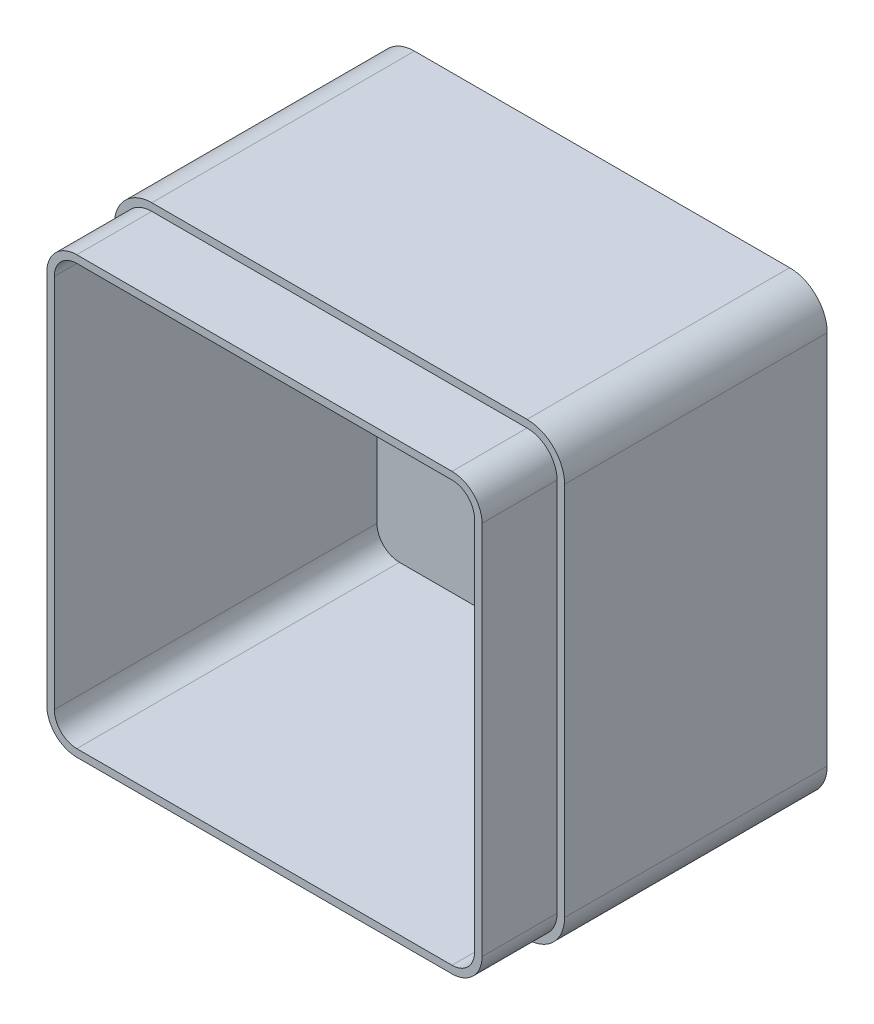
ISO-10303-21;
HEADER;
FILE_DESCRIPTION(('STEP AP214'),'2;1');
FILE_NAME('part.step','',(''),(''),'','','');
FILE_SCHEMA(('AUTOMOTIVE_DESIGN { 1 0 10303 214 1 1 1 1 }'));
ENDSEC;
DATA;
#1=APPLICATION_CONTEXT('core data for automotive mechanical design processes');
#2=APPLICATION_PROTOCOL_DEFINITION('international standard','automotive_design',2000,#1);
#3=PRODUCT_CONTEXT('',#1,'mechanical');
#4=PRODUCT('Part','Part','',(#3));
#5=PRODUCT_RELATED_PRODUCT_CATEGORY('part','',(#4));
#6=PRODUCT_DEFINITION_FORMATION('','',#4);
#7=PRODUCT_DEFINITION_CONTEXT('part definition',#1,'design');
#8=PRODUCT_DEFINITION('design','',#6,#7);
#9=PRODUCT_DEFINITION_SHAPE('','',#8);
#10=(LENGTH_UNIT() NAMED_UNIT(*) SI_UNIT(.MILLI.,.METRE.));
#11=(NAMED_UNIT(*) PLANE_ANGLE_UNIT() SI_UNIT($,.RADIAN.));
#12=(NAMED_UNIT(*) SI_UNIT($,.STERADIAN.) SOLID_ANGLE_UNIT());
#13=UNCERTAINTY_MEASURE_WITH_UNIT(LENGTH_MEASURE(1.E-05),#10,'distance_accuracy_value','');
#14=(GEOMETRIC_REPRESENTATION_CONTEXT(3) GLOBAL_UNCERTAINTY_ASSIGNED_CONTEXT((#13)) GLOBAL_UNIT_ASSIGNED_CONTEXT((#10,
#11,#12)) REPRESENTATION_CONTEXT('',''));
#15=CARTESIAN_POINT('',(0.,0.,0.));
#16=DIRECTION('',(0.,0.,1.));
#17=DIRECTION('',(1.,0.,0.));
#18=AXIS2_PLACEMENT_3D('',#15,#16,#17);
#19=CARTESIAN_POINT('',(0.,0.,90.));
#20=DIRECTION('',(0.,0.,-1.));
#21=DIRECTION('',(-1.,0.,0.));
#22=AXIS2_PLACEMENT_3D('',#19,#20,#21);
#23=PLANE('',#22);
#24=DIRECTION('',(0.,1.,0.));
#25=VECTOR('',#24,1.);
#26=CARTESIAN_POINT('',(116.,0.,90.));
#27=LINE('',#26,#25);
#28=CARTESIAN_POINT('',(116.,10.,90.));
#29=VERTEX_POINT('',#28);
#30=CARTESIAN_POINT('',(116.,110.,90.));
#31=VERTEX_POINT('',#30);
#32=EDGE_CURVE('E335',#29,#31,#27,.T.);
#33=ORIENTED_EDGE('',*,*,#32,.F.);
#34=CARTESIAN_POINT('',(110.,10.,90.));
#35=DIRECTION('',(0.,0.,-1.));
#36=DIRECTION('',(-1.,0.,0.));
#37=AXIS2_PLACEMENT_3D('',#34,#35,#36);
#38=CIRCLE('',#37,6.);
#39=CARTESIAN_POINT('',(110.,4.,90.));
#40=VERTEX_POINT('',#39);
#41=EDGE_CURVE('E333',#40,#29,#38,.F.);
#42=ORIENTED_EDGE('',*,*,#41,.F.);
#43=DIRECTION('',(1.,0.,0.));
#44=VECTOR('',#43,1.);
#45=CARTESIAN_POINT('',(0.,4.,90.));
#46=LINE('',#45,#44);
#47=CARTESIAN_POINT('',(9.99999999999999,4.,90.));
#48=VERTEX_POINT('',#47);
#49=EDGE_CURVE('E330',#48,#40,#46,.T.);
#50=ORIENTED_EDGE('',*,*,#49,.F.);
#51=CARTESIAN_POINT('',(10.,10.,90.));
#52=DIRECTION('',(0.,0.,-1.));
#53=DIRECTION('',(-1.,0.,0.));
#54=AXIS2_PLACEMENT_3D('',#51,#52,#53);
#55=CIRCLE('',#54,6.);
#56=CARTESIAN_POINT('',(4.,9.99999999999999,90.));
#57=VERTEX_POINT('',#56);
#58=EDGE_CURVE('E331',#57,#48,#55,.F.);
#59=ORIENTED_EDGE('',*,*,#58,.F.);
#60=DIRECTION('',(0.,-1.,0.));
#61=VECTOR('',#60,1.);
#62=CARTESIAN_POINT('',(4.,0.,90.));
#63=LINE('',#62,#61);
#64=CARTESIAN_POINT('',(4.,110.,90.));
#65=VERTEX_POINT('',#64);
#66=EDGE_CURVE('E296',#65,#57,#63,.T.);
#67=ORIENTED_EDGE('',*,*,#66,.F.);
#68=CARTESIAN_POINT('',(10.,110.,90.));
#69=DIRECTION('',(0.,0.,-1.));
#70=DIRECTION('',(-1.,0.,0.));
#71=AXIS2_PLACEMENT_3D('',#68,#69,#70);
#72=CIRCLE('',#71,6.);
#73=CARTESIAN_POINT('',(9.99999999999999,116.,90.));
#74=VERTEX_POINT('',#73);
#75=EDGE_CURVE('E322',#74,#65,#72,.F.);
#76=ORIENTED_EDGE('',*,*,#75,.F.);
#77=DIRECTION('',(-1.,0.,0.));
#78=VECTOR('',#77,1.);
#79=CARTESIAN_POINT('',(0.,116.,90.));
#80=LINE('',#79,#78);
#81=CARTESIAN_POINT('',(110.,116.,90.));
#82=VERTEX_POINT('',#81);
#83=EDGE_CURVE('E327',#82,#74,#80,.T.);
#84=ORIENTED_EDGE('',*,*,#83,.F.);
#85=CARTESIAN_POINT('',(110.,110.,90.));
#86=DIRECTION('',(0.,0.,-1.));
#87=DIRECTION('',(-1.,0.,0.));
#88=AXIS2_PLACEMENT_3D('',#85,#86,#87);
#89=CIRCLE('',#88,6.);
#90=EDGE_CURVE('E317',#31,#82,#89,.F.);
#91=ORIENTED_EDGE('',*,*,#90,.F.);
#92=EDGE_LOOP('',(#33,#42,#50,#59,#67,#76,#84,#91));
#93=FACE_BOUND('',#92,.T.);
#94=CARTESIAN_POINT('',(110.,10.,90.));
#95=DIRECTION('',(0.,0.,1.));
#96=DIRECTION('',(1.,0.,0.));
#97=AXIS2_PLACEMENT_3D('',#94,#95,#96);
#98=CIRCLE('',#97,7.99999999999999);
#99=CARTESIAN_POINT('',(110.,2.,90.));
#100=VERTEX_POINT('',#99);
#101=CARTESIAN_POINT('',(118.,10.,90.));
#102=VERTEX_POINT('',#101);
#103=EDGE_CURVE('E240',#100,#102,#98,.T.);
#104=ORIENTED_EDGE('',*,*,#103,.T.);
#105=DIRECTION('',(0.,1.,0.));
#106=VECTOR('',#105,1.);
#107=CARTESIAN_POINT('',(118.,10.,90.));
#108=LINE('',#107,#106);
#109=CARTESIAN_POINT('',(118.,110.,90.));
#110=VERTEX_POINT('',#109);
#111=EDGE_CURVE('E200',#102,#110,#108,.T.);
#112=ORIENTED_EDGE('',*,*,#111,.T.);
#113=CARTESIAN_POINT('',(110.,110.,90.));
#114=DIRECTION('',(0.,0.,1.));
#115=DIRECTION('',(1.,0.,0.));
#116=AXIS2_PLACEMENT_3D('',#113,#114,#115);
#117=CIRCLE('',#116,7.99999999999999);
#118=CARTESIAN_POINT('',(110.,118.,90.));
#119=VERTEX_POINT('',#118);
#120=EDGE_CURVE('E48',#110,#119,#117,.T.);
#121=ORIENTED_EDGE('',*,*,#120,.T.);
#122=DIRECTION('',(-1.,0.,0.));
#123=VECTOR('',#122,1.);
#124=CARTESIAN_POINT('',(110.,118.,90.));
#125=LINE('',#124,#123);
#126=CARTESIAN_POINT('',(9.99999999999999,118.,90.));
#127=VERTEX_POINT('',#126);
#128=EDGE_CURVE('E244',#119,#127,#125,.T.);
#129=ORIENTED_EDGE('',*,*,#128,.T.);
#130=CARTESIAN_POINT('',(10.,110.,90.));
#131=DIRECTION('',(0.,0.,1.));
#132=DIRECTION('',(1.,0.,0.));
#133=AXIS2_PLACEMENT_3D('',#130,#131,#132);
#134=CIRCLE('',#133,7.99999999999999);
#135=CARTESIAN_POINT('',(2.,110.,90.));
#136=VERTEX_POINT('',#135);
#137=EDGE_CURVE('E247',#127,#136,#134,.T.);
#138=ORIENTED_EDGE('',*,*,#137,.T.);
#139=DIRECTION('',(0.,-1.,0.));
#140=VECTOR('',#139,1.);
#141=CARTESIAN_POINT('',(2.,110.,90.));
#142=LINE('',#141,#140);
#143=CARTESIAN_POINT('',(2.,9.99999999999999,90.));
#144=VERTEX_POINT('',#143);
#145=EDGE_CURVE('E250',#136,#144,#142,.T.);
#146=ORIENTED_EDGE('',*,*,#145,.T.);
#147=CARTESIAN_POINT('',(10.,10.,90.));
#148=DIRECTION('',(0.,0.,1.));
#149=DIRECTION('',(1.,0.,0.));
#150=AXIS2_PLACEMENT_3D('',#147,#148,#149);
#151=CIRCLE('',#150,8.);
#152=CARTESIAN_POINT('',(9.99999999999999,2.,90.));
#153=VERTEX_POINT('',#152);
#154=EDGE_CURVE('E223',#144,#153,#151,.T.);
#155=ORIENTED_EDGE('',*,*,#154,.T.);
#156=DIRECTION('',(1.,0.,0.));
#157=VECTOR('',#156,1.);
#158=CARTESIAN_POINT('',(10.,2.,90.));
#159=LINE('',#158,#157);
#160=EDGE_CURVE('E220',#153,#100,#159,.T.);
#161=ORIENTED_EDGE('',*,*,#160,.T.);
#162=EDGE_LOOP('',(#104,#112,#121,#129,#138,#146,#155,#161));
#163=FACE_BOUND('',#162,.T.);
#164=ADVANCED_FACE('F33',(#93,#163),#23,.F.);
#165=CARTESIAN_POINT('',(4.,0.,90.));
#166=DIRECTION('',(1.,0.,0.));
#167=DIRECTION('',(0.,0.,-1.));
#168=AXIS2_PLACEMENT_3D('',#165,#166,#167);
#169=PLANE('',#168);
#170=DIRECTION('',(0.,-1.,0.));
#171=VECTOR('',#170,1.);
#172=CARTESIAN_POINT('',(4.,0.,4.));
#173=LINE('',#172,#171);
#174=CARTESIAN_POINT('',(4.,110.,4.));
#175=VERTEX_POINT('',#174);
#176=CARTESIAN_POINT('',(4.,9.99999999999999,4.));
#177=VERTEX_POINT('',#176);
#178=EDGE_CURVE('E282',#175,#177,#173,.T.);
#179=ORIENTED_EDGE('',*,*,#178,.F.);
#180=DIRECTION('',(0.,0.,-1.));
#181=VECTOR('',#180,1.);
#182=CARTESIAN_POINT('',(4.,110.,90.));
#183=LINE('',#182,#181);
#184=EDGE_CURVE('E289',#65,#175,#183,.T.);
#185=ORIENTED_EDGE('',*,*,#184,.F.);
#186=ORIENTED_EDGE('',*,*,#66,.T.);
#187=DIRECTION('',(0.,0.,-1.));
#188=VECTOR('',#187,1.);
#189=CARTESIAN_POINT('',(4.,9.99999999999999,90.));
#190=LINE('',#189,#188);
#191=EDGE_CURVE('E286',#177,#57,#190,.F.);
#192=ORIENTED_EDGE('',*,*,#191,.F.);
#193=EDGE_LOOP('',(#179,#185,#186,#192));
#194=FACE_BOUND('',#193,.T.);
#195=ADVANCED_FACE('F426',(#194),#169,.T.);
#196=CARTESIAN_POINT('',(0.,4.,90.));
#197=DIRECTION('',(0.,1.,0.));
#198=DIRECTION('',(0.,0.,1.));
#199=AXIS2_PLACEMENT_3D('',#196,#197,#198);
#200=PLANE('',#199);
#201=DIRECTION('',(1.,0.,0.));
#202=VECTOR('',#201,1.);
#203=CARTESIAN_POINT('',(0.,4.,4.));
#204=LINE('',#203,#202);
#205=CARTESIAN_POINT('',(9.99999999999999,4.,4.));
#206=VERTEX_POINT('',#205);
#207=CARTESIAN_POINT('',(110.,4.,4.));
#208=VERTEX_POINT('',#207);
#209=EDGE_CURVE('E285',#206,#208,#204,.T.);
#210=ORIENTED_EDGE('',*,*,#209,.F.);
#211=DIRECTION('',(0.,0.,1.));
#212=VECTOR('',#211,1.);
#213=CARTESIAN_POINT('',(9.99999999999999,4.,90.));
#214=LINE('',#213,#212);
#215=EDGE_CURVE('E314',#48,#206,#214,.F.);
#216=ORIENTED_EDGE('',*,*,#215,.F.);
#217=ORIENTED_EDGE('',*,*,#49,.T.);
#218=DIRECTION('',(0.,0.,1.));
#219=VECTOR('',#218,1.);
#220=CARTESIAN_POINT('',(110.,4.,90.));
#221=LINE('',#220,#219);
#222=EDGE_CURVE('E292',#208,#40,#221,.T.);
#223=ORIENTED_EDGE('',*,*,#222,.F.);
#224=EDGE_LOOP('',(#210,#216,#217,#223));
#225=FACE_BOUND('',#224,.T.);
#226=ADVANCED_FACE('F432',(#225),#200,.T.);
#227=CARTESIAN_POINT('',(116.,0.,90.));
#228=DIRECTION('',(-1.,0.,0.));
#229=DIRECTION('',(0.,-1.,0.));
#230=AXIS2_PLACEMENT_3D('',#227,#228,#229);
#231=PLANE('',#230);
#232=DIRECTION('',(0.,1.,0.));
#233=VECTOR('',#232,1.);
#234=CARTESIAN_POINT('',(116.,0.,4.));
#235=LINE('',#234,#233);
#236=CARTESIAN_POINT('',(116.,10.,4.));
#237=VERTEX_POINT('',#236);
#238=CARTESIAN_POINT('',(116.,110.,4.));
#239=VERTEX_POINT('',#238);
#240=EDGE_CURVE('E297',#237,#239,#235,.T.);
#241=ORIENTED_EDGE('',*,*,#240,.F.);
#242=DIRECTION('',(0.,0.,1.));
#243=VECTOR('',#242,1.);
#244=CARTESIAN_POINT('',(116.,10.,90.));
#245=LINE('',#244,#243);
#246=EDGE_CURVE('E300',#29,#237,#245,.F.);
#247=ORIENTED_EDGE('',*,*,#246,.F.);
#248=ORIENTED_EDGE('',*,*,#32,.T.);
#249=DIRECTION('',(0.,0.,1.));
#250=VECTOR('',#249,1.);
#251=CARTESIAN_POINT('',(116.,110.,90.));
#252=LINE('',#251,#250);
#253=EDGE_CURVE('E320',#239,#31,#252,.T.);
#254=ORIENTED_EDGE('',*,*,#253,.F.);
#255=EDGE_LOOP('',(#241,#247,#248,#254));
#256=FACE_BOUND('',#255,.T.);
#257=ADVANCED_FACE('F461',(#256),#231,.T.);
#258=CARTESIAN_POINT('',(0.,116.,90.));
#259=DIRECTION('',(0.,-1.,0.));
#260=DIRECTION('',(0.,0.,-1.));
#261=AXIS2_PLACEMENT_3D('',#258,#259,#260);
#262=PLANE('',#261);
#263=ORIENTED_EDGE('',*,*,#83,.T.);
#264=DIRECTION('',(0.,0.,-1.));
#265=VECTOR('',#264,1.);
#266=CARTESIAN_POINT('',(9.99999999999999,116.,90.));
#267=LINE('',#266,#265);
#268=CARTESIAN_POINT('',(9.99999999999999,116.,4.));
#269=VERTEX_POINT('',#268);
#270=EDGE_CURVE('E325',#269,#74,#267,.F.);
#271=ORIENTED_EDGE('',*,*,#270,.F.);
#272=DIRECTION('',(-1.,0.,0.));
#273=VECTOR('',#272,1.);
#274=CARTESIAN_POINT('',(0.,116.,4.));
#275=LINE('',#274,#273);
#276=CARTESIAN_POINT('',(110.,116.,4.));
#277=VERTEX_POINT('',#276);
#278=EDGE_CURVE('E293',#277,#269,#275,.T.);
#279=ORIENTED_EDGE('',*,*,#278,.F.);
#280=DIRECTION('',(0.,0.,-1.));
#281=VECTOR('',#280,1.);
#282=CARTESIAN_POINT('',(110.,116.,90.));
#283=LINE('',#282,#281);
#284=EDGE_CURVE('E311',#82,#277,#283,.T.);
#285=ORIENTED_EDGE('',*,*,#284,.F.);
#286=EDGE_LOOP('',(#263,#271,#279,#285));
#287=FACE_BOUND('',#286,.T.);
#288=ADVANCED_FACE('F465',(#287),#262,.T.);
#289=CARTESIAN_POINT('',(0.,0.,4.));
#290=DIRECTION('',(0.,0.,-1.));
#291=DIRECTION('',(-1.,0.,0.));
#292=AXIS2_PLACEMENT_3D('',#289,#290,#291);
#293=PLANE('',#292);
#294=ORIENTED_EDGE('',*,*,#278,.T.);
#295=CARTESIAN_POINT('',(10.,110.,4.));
#296=DIRECTION('',(0.,0.,-1.));
#297=DIRECTION('',(-1.,0.,0.));
#298=AXIS2_PLACEMENT_3D('',#295,#296,#297);
#299=CIRCLE('',#298,6.);
#300=EDGE_CURVE('E309',#175,#269,#299,.T.);
#301=ORIENTED_EDGE('',*,*,#300,.F.);
#302=ORIENTED_EDGE('',*,*,#178,.T.);
#303=CARTESIAN_POINT('',(10.,10.,4.));
#304=DIRECTION('',(0.,0.,-1.));
#305=DIRECTION('',(-1.,0.,0.));
#306=AXIS2_PLACEMENT_3D('',#303,#304,#305);
#307=CIRCLE('',#306,6.);
#308=EDGE_CURVE('E305',#206,#177,#307,.T.);
#309=ORIENTED_EDGE('',*,*,#308,.F.);
#310=ORIENTED_EDGE('',*,*,#209,.T.);
#311=CARTESIAN_POINT('',(110.,10.,4.));
#312=DIRECTION('',(0.,0.,-1.));
#313=DIRECTION('',(-1.,0.,0.));
#314=AXIS2_PLACEMENT_3D('',#311,#312,#313);
#315=CIRCLE('',#314,6.);
#316=EDGE_CURVE('E301',#237,#208,#315,.T.);
#317=ORIENTED_EDGE('',*,*,#316,.F.);
#318=ORIENTED_EDGE('',*,*,#240,.T.);
#319=CARTESIAN_POINT('',(110.,110.,4.));
#320=DIRECTION('',(0.,0.,-1.));
#321=DIRECTION('',(-1.,0.,0.));
#322=AXIS2_PLACEMENT_3D('',#319,#320,#321);
#323=CIRCLE('',#322,6.);
#324=EDGE_CURVE('E298',#277,#239,#323,.T.);
#325=ORIENTED_EDGE('',*,*,#324,.F.);
#326=EDGE_LOOP('',(#294,#301,#302,#309,#310,#317,#318,#325));
#327=FACE_BOUND('',#326,.T.);
#328=ADVANCED_FACE('F469',(#327),#293,.F.);
#329=CARTESIAN_POINT('',(110.,110.,90.));
#330=DIRECTION('',(0.,0.,-1.));
#331=DIRECTION('',(-1.,0.,0.));
#332=AXIS2_PLACEMENT_3D('',#329,#330,#331);
#333=CYLINDRICAL_SURFACE('',#332,6.);
#334=ORIENTED_EDGE('',*,*,#90,.T.);
#335=ORIENTED_EDGE('',*,*,#284,.T.);
#336=ORIENTED_EDGE('',*,*,#324,.T.);
#337=ORIENTED_EDGE('',*,*,#253,.T.);
#338=EDGE_LOOP('',(#334,#335,#336,#337));
#339=FACE_BOUND('',#338,.T.);
#340=ADVANCED_FACE('F473',(#339),#333,.F.);
#341=CARTESIAN_POINT('',(110.,10.,90.));
#342=DIRECTION('',(0.,0.,-1.));
#343=DIRECTION('',(-1.,0.,0.));
#344=AXIS2_PLACEMENT_3D('',#341,#342,#343);
#345=CYLINDRICAL_SURFACE('',#344,6.);
#346=ORIENTED_EDGE('',*,*,#41,.T.);
#347=ORIENTED_EDGE('',*,*,#246,.T.);
#348=ORIENTED_EDGE('',*,*,#316,.T.);
#349=ORIENTED_EDGE('',*,*,#222,.T.);
#350=EDGE_LOOP('',(#346,#347,#348,#349));
#351=FACE_BOUND('',#350,.T.);
#352=ADVANCED_FACE('F477',(#351),#345,.F.);
#353=CARTESIAN_POINT('',(10.,10.,90.));
#354=DIRECTION('',(0.,0.,-1.));
#355=DIRECTION('',(-1.,0.,0.));
#356=AXIS2_PLACEMENT_3D('',#353,#354,#355);
#357=CYLINDRICAL_SURFACE('',#356,6.);
#358=ORIENTED_EDGE('',*,*,#58,.T.);
#359=ORIENTED_EDGE('',*,*,#215,.T.);
#360=ORIENTED_EDGE('',*,*,#308,.T.);
#361=ORIENTED_EDGE('',*,*,#191,.T.);
#362=EDGE_LOOP('',(#358,#359,#360,#361));
#363=FACE_BOUND('',#362,.T.);
#364=ADVANCED_FACE('F480',(#363),#357,.F.);
#365=CARTESIAN_POINT('',(10.,110.,90.));
#366=DIRECTION('',(0.,0.,-1.));
#367=DIRECTION('',(-1.,0.,0.));
#368=AXIS2_PLACEMENT_3D('',#365,#366,#367);
#369=CYLINDRICAL_SURFACE('',#368,6.);
#370=ORIENTED_EDGE('',*,*,#75,.T.);
#371=ORIENTED_EDGE('',*,*,#184,.T.);
#372=ORIENTED_EDGE('',*,*,#300,.T.);
#373=ORIENTED_EDGE('',*,*,#270,.T.);
#374=EDGE_LOOP('',(#370,#371,#372,#373));
#375=FACE_BOUND('',#374,.T.);
#376=ADVANCED_FACE('F438',(#375),#369,.F.);
#377=CARTESIAN_POINT('',(110.,10.,70.));
#378=DIRECTION('',(0.,0.,1.));
#379=DIRECTION('',(1.,0.,0.));
#380=AXIS2_PLACEMENT_3D('',#377,#378,#379);
#381=PLANE('',#380);
#382=DIRECTION('',(1.,0.,0.));
#383=VECTOR('',#382,1.);
#384=CARTESIAN_POINT('',(10.,2.,70.));
#385=LINE('',#384,#383);
#386=CARTESIAN_POINT('',(9.99999999999999,2.,70.));
#387=VERTEX_POINT('',#386);
#388=CARTESIAN_POINT('',(110.,2.,70.));
#389=VERTEX_POINT('',#388);
#390=EDGE_CURVE('E206',#387,#389,#385,.T.);
#391=ORIENTED_EDGE('',*,*,#390,.F.);
#392=CARTESIAN_POINT('',(10.,10.,70.));
#393=DIRECTION('',(0.,0.,1.));
#394=DIRECTION('',(1.,0.,0.));
#395=AXIS2_PLACEMENT_3D('',#392,#393,#394);
#396=CIRCLE('',#395,8.);
#397=CARTESIAN_POINT('',(2.,9.99999999999999,70.));
#398=VERTEX_POINT('',#397);
#399=EDGE_CURVE('E236',#398,#387,#396,.T.);
#400=ORIENTED_EDGE('',*,*,#399,.F.);
#401=DIRECTION('',(0.,-1.,0.));
#402=VECTOR('',#401,1.);
#403=CARTESIAN_POINT('',(2.,110.,70.));
#404=LINE('',#403,#402);
#405=CARTESIAN_POINT('',(2.,110.,70.));
#406=VERTEX_POINT('',#405);
#407=EDGE_CURVE('E233',#406,#398,#404,.T.);
#408=ORIENTED_EDGE('',*,*,#407,.F.);
#409=CARTESIAN_POINT('',(10.,110.,70.));
#410=DIRECTION('',(0.,0.,1.));
#411=DIRECTION('',(1.,0.,0.));
#412=AXIS2_PLACEMENT_3D('',#409,#410,#411);
#413=CIRCLE('',#412,7.99999999999999);
#414=CARTESIAN_POINT('',(9.99999999999999,118.,70.));
#415=VERTEX_POINT('',#414);
#416=EDGE_CURVE('E230',#415,#406,#413,.T.);
#417=ORIENTED_EDGE('',*,*,#416,.F.);
#418=DIRECTION('',(-1.,0.,0.));
#419=VECTOR('',#418,1.);
#420=CARTESIAN_POINT('',(110.,118.,70.));
#421=LINE('',#420,#419);
#422=CARTESIAN_POINT('',(110.,118.,70.));
#423=VERTEX_POINT('',#422);
#424=EDGE_CURVE('E227',#423,#415,#421,.T.);
#425=ORIENTED_EDGE('',*,*,#424,.F.);
#426=CARTESIAN_POINT('',(110.,110.,70.));
#427=DIRECTION('',(0.,0.,1.));
#428=DIRECTION('',(1.,0.,0.));
#429=AXIS2_PLACEMENT_3D('',#426,#427,#428);
#430=CIRCLE('',#429,7.99999999999999);
#431=CARTESIAN_POINT('',(118.,110.,70.));
#432=VERTEX_POINT('',#431);
#433=EDGE_CURVE('E216',#432,#423,#430,.T.);
#434=ORIENTED_EDGE('',*,*,#433,.F.);
#435=DIRECTION('',(0.,1.,0.));
#436=VECTOR('',#435,1.);
#437=CARTESIAN_POINT('',(118.,10.,70.));
#438=LINE('',#437,#436);
#439=CARTESIAN_POINT('',(118.,10.,70.));
#440=VERTEX_POINT('',#439);
#441=EDGE_CURVE('E198',#440,#432,#438,.T.);
#442=ORIENTED_EDGE('',*,*,#441,.F.);
#443=CARTESIAN_POINT('',(110.,10.,70.));
#444=DIRECTION('',(0.,0.,1.));
#445=DIRECTION('',(1.,0.,0.));
#446=AXIS2_PLACEMENT_3D('',#443,#444,#445);
#447=CIRCLE('',#446,7.99999999999999);
#448=EDGE_CURVE('E212',#389,#440,#447,.T.);
#449=ORIENTED_EDGE('',*,*,#448,.F.);
#450=EDGE_LOOP('',(#391,#400,#408,#417,#425,#434,#442,#449));
#451=FACE_BOUND('',#450,.T.);
#452=CARTESIAN_POINT('',(110.,10.,70.));
#453=DIRECTION('',(0.,0.,1.));
#454=DIRECTION('',(1.,0.,0.));
#455=AXIS2_PLACEMENT_3D('',#452,#453,#454);
#456=CIRCLE('',#455,9.99999999999999);
#457=CARTESIAN_POINT('',(110.,0.,70.));
#458=VERTEX_POINT('',#457);
#459=CARTESIAN_POINT('',(120.,10.,70.));
#460=VERTEX_POINT('',#459);
#461=EDGE_CURVE('E256',#458,#460,#456,.T.);
#462=ORIENTED_EDGE('',*,*,#461,.T.);
#463=DIRECTION('',(0.,1.,0.));
#464=VECTOR('',#463,1.);
#465=CARTESIAN_POINT('',(120.,10.,70.));
#466=LINE('',#465,#464);
#467=CARTESIAN_POINT('',(120.,110.,70.));
#468=VERTEX_POINT('',#467);
#469=EDGE_CURVE('E269',#460,#468,#466,.T.);
#470=ORIENTED_EDGE('',*,*,#469,.T.);
#471=CARTESIAN_POINT('',(110.,110.,70.));
#472=DIRECTION('',(0.,0.,1.));
#473=DIRECTION('',(1.,0.,0.));
#474=AXIS2_PLACEMENT_3D('',#471,#472,#473);
#475=CIRCLE('',#474,9.99999999999999);
#476=CARTESIAN_POINT('',(110.,120.,70.));
#477=VERTEX_POINT('',#476);
#478=EDGE_CURVE('E271',#468,#477,#475,.T.);
#479=ORIENTED_EDGE('',*,*,#478,.T.);
#480=DIRECTION('',(-1.,0.,0.));
#481=VECTOR('',#480,1.);
#482=CARTESIAN_POINT('',(110.,120.,70.));
#483=LINE('',#482,#481);
#484=CARTESIAN_POINT('',(10.,120.,70.));
#485=VERTEX_POINT('',#484);
#486=EDGE_CURVE('E56',#477,#485,#483,.T.);
#487=ORIENTED_EDGE('',*,*,#486,.T.);
#488=CARTESIAN_POINT('',(10.,110.,70.));
#489=DIRECTION('',(0.,0.,1.));
#490=DIRECTION('',(1.,0.,0.));
#491=AXIS2_PLACEMENT_3D('',#488,#489,#490);
#492=CIRCLE('',#491,9.99999999999999);
#493=CARTESIAN_POINT('',(0.,110.,70.));
#494=VERTEX_POINT('',#493);
#495=EDGE_CURVE('E274',#485,#494,#492,.T.);
#496=ORIENTED_EDGE('',*,*,#495,.T.);
#497=DIRECTION('',(0.,-1.,0.));
#498=VECTOR('',#497,1.);
#499=CARTESIAN_POINT('',(0.,110.,70.));
#500=LINE('',#499,#498);
#501=CARTESIAN_POINT('',(0.,10.,70.));
#502=VERTEX_POINT('',#501);
#503=EDGE_CURVE('E276',#494,#502,#500,.T.);
#504=ORIENTED_EDGE('',*,*,#503,.T.);
#505=CARTESIAN_POINT('',(10.,10.,70.));
#506=DIRECTION('',(0.,0.,1.));
#507=DIRECTION('',(1.,0.,0.));
#508=AXIS2_PLACEMENT_3D('',#505,#506,#507);
#509=CIRCLE('',#508,10.);
#510=CARTESIAN_POINT('',(9.99999999999999,0.,70.));
#511=VERTEX_POINT('',#510);
#512=EDGE_CURVE('E278',#502,#511,#509,.T.);
#513=ORIENTED_EDGE('',*,*,#512,.T.);
#514=DIRECTION('',(1.,0.,0.));
#515=VECTOR('',#514,1.);
#516=CARTESIAN_POINT('',(9.99999999999999,0.,70.));
#517=LINE('',#516,#515);
#518=EDGE_CURVE('E280',#511,#458,#517,.T.);
#519=ORIENTED_EDGE('',*,*,#518,.T.);
#520=EDGE_LOOP('',(#462,#470,#479,#487,#496,#504,#513,#519));
#521=FACE_BOUND('',#520,.T.);
#522=ADVANCED_FACE('F211',(#451,#521),#381,.T.);
#523=CARTESIAN_POINT('',(110.,10.,70.));
#524=DIRECTION('',(0.,0.,1.));
#525=DIRECTION('',(1.,0.,0.));
#526=AXIS2_PLACEMENT_3D('',#523,#524,#525);
#527=CYLINDRICAL_SURFACE('',#526,7.99999999999999);
#528=ORIENTED_EDGE('',*,*,#103,.F.);
#529=DIRECTION('',(0.,0.,1.));
#530=VECTOR('',#529,1.);
#531=CARTESIAN_POINT('',(110.,2.,70.));
#532=LINE('',#531,#530);
#533=EDGE_CURVE('E219',#389,#100,#532,.T.);
#534=ORIENTED_EDGE('',*,*,#533,.F.);
#535=ORIENTED_EDGE('',*,*,#448,.T.);
#536=DIRECTION('',(0.,0.,1.));
#537=VECTOR('',#536,1.);
#538=CARTESIAN_POINT('',(118.,10.,70.));
#539=LINE('',#538,#537);
#540=EDGE_CURVE('E195',#440,#102,#539,.T.);
#541=ORIENTED_EDGE('',*,*,#540,.T.);
#542=EDGE_LOOP('',(#528,#534,#535,#541));
#543=FACE_BOUND('',#542,.T.);
#544=ADVANCED_FACE('F218',(#543),#527,.T.);
#545=CARTESIAN_POINT('',(10.,2.,70.));
#546=DIRECTION('',(0.,-1.,0.));
#547=DIRECTION('',(0.,0.,-1.));
#548=AXIS2_PLACEMENT_3D('',#545,#546,#547);
#549=PLANE('',#548);
#550=ORIENTED_EDGE('',*,*,#160,.F.);
#551=DIRECTION('',(0.,0.,1.));
#552=VECTOR('',#551,1.);
#553=CARTESIAN_POINT('',(9.99999999999999,2.,70.));
#554=LINE('',#553,#552);
#555=EDGE_CURVE('E257',#387,#153,#554,.T.);
#556=ORIENTED_EDGE('',*,*,#555,.F.);
#557=ORIENTED_EDGE('',*,*,#390,.T.);
#558=ORIENTED_EDGE('',*,*,#533,.T.);
#559=EDGE_LOOP('',(#550,#556,#557,#558));
#560=FACE_BOUND('',#559,.T.);
#561=ADVANCED_FACE('F456',(#560),#549,.T.);
#562=CARTESIAN_POINT('',(10.,10.,70.));
#563=DIRECTION('',(0.,0.,1.));
#564=DIRECTION('',(1.,0.,0.));
#565=AXIS2_PLACEMENT_3D('',#562,#563,#564);
#566=CYLINDRICAL_SURFACE('',#565,8.);
#567=ORIENTED_EDGE('',*,*,#154,.F.);
#568=DIRECTION('',(0.,0.,1.));
#569=VECTOR('',#568,1.);
#570=CARTESIAN_POINT('',(2.,9.99999999999999,70.));
#571=LINE('',#570,#569);
#572=EDGE_CURVE('E259',#398,#144,#571,.T.);
#573=ORIENTED_EDGE('',*,*,#572,.F.);
#574=ORIENTED_EDGE('',*,*,#399,.T.);
#575=ORIENTED_EDGE('',*,*,#555,.T.);
#576=EDGE_LOOP('',(#567,#573,#574,#575));
#577=FACE_BOUND('',#576,.T.);
#578=ADVANCED_FACE('F523',(#577),#566,.T.);
#579=CARTESIAN_POINT('',(2.,110.,70.));
#580=DIRECTION('',(-1.,0.,0.));
#581=DIRECTION('',(0.,-1.,0.));
#582=AXIS2_PLACEMENT_3D('',#579,#580,#581);
#583=PLANE('',#582);
#584=ORIENTED_EDGE('',*,*,#145,.F.);
#585=DIRECTION('',(0.,0.,1.));
#586=VECTOR('',#585,1.);
#587=CARTESIAN_POINT('',(2.,110.,70.));
#588=LINE('',#587,#586);
#589=EDGE_CURVE('E261',#406,#136,#588,.T.);
#590=ORIENTED_EDGE('',*,*,#589,.F.);
#591=ORIENTED_EDGE('',*,*,#407,.T.);
#592=ORIENTED_EDGE('',*,*,#572,.T.);
#593=EDGE_LOOP('',(#584,#590,#591,#592));
#594=FACE_BOUND('',#593,.T.);
#595=ADVANCED_FACE('F531',(#594),#583,.T.);
#596=CARTESIAN_POINT('',(10.,110.,70.));
#597=DIRECTION('',(0.,0.,1.));
#598=DIRECTION('',(1.,0.,0.));
#599=AXIS2_PLACEMENT_3D('',#596,#597,#598);
#600=CYLINDRICAL_SURFACE('',#599,7.99999999999999);
#601=ORIENTED_EDGE('',*,*,#137,.F.);
#602=DIRECTION('',(0.,0.,1.));
#603=VECTOR('',#602,1.);
#604=CARTESIAN_POINT('',(9.99999999999999,118.,70.));
#605=LINE('',#604,#603);
#606=EDGE_CURVE('E263',#415,#127,#605,.T.);
#607=ORIENTED_EDGE('',*,*,#606,.F.);
#608=ORIENTED_EDGE('',*,*,#416,.T.);
#609=ORIENTED_EDGE('',*,*,#589,.T.);
#610=EDGE_LOOP('',(#601,#607,#608,#609));
#611=FACE_BOUND('',#610,.T.);
#612=ADVANCED_FACE('F539',(#611),#600,.T.);
#613=CARTESIAN_POINT('',(110.,118.,70.));
#614=DIRECTION('',(0.,1.,0.));
#615=DIRECTION('',(0.,0.,1.));
#616=AXIS2_PLACEMENT_3D('',#613,#614,#615);
#617=PLANE('',#616);
#618=ORIENTED_EDGE('',*,*,#128,.F.);
#619=DIRECTION('',(0.,0.,1.));
#620=VECTOR('',#619,1.);
#621=CARTESIAN_POINT('',(110.,118.,70.));
#622=LINE('',#621,#620);
#623=EDGE_CURVE('E265',#423,#119,#622,.T.);
#624=ORIENTED_EDGE('',*,*,#623,.F.);
#625=ORIENTED_EDGE('',*,*,#424,.T.);
#626=ORIENTED_EDGE('',*,*,#606,.T.);
#627=EDGE_LOOP('',(#618,#624,#625,#626));
#628=FACE_BOUND('',#627,.T.);
#629=ADVANCED_FACE('F450',(#628),#617,.T.);
#630=CARTESIAN_POINT('',(110.,110.,70.));
#631=DIRECTION('',(0.,0.,1.));
#632=DIRECTION('',(1.,0.,0.));
#633=AXIS2_PLACEMENT_3D('',#630,#631,#632);
#634=CYLINDRICAL_SURFACE('',#633,7.99999999999999);
#635=ORIENTED_EDGE('',*,*,#120,.F.);
#636=DIRECTION('',(0.,0.,1.));
#637=VECTOR('',#636,1.);
#638=CARTESIAN_POINT('',(118.,110.,70.));
#639=LINE('',#638,#637);
#640=EDGE_CURVE('E205',#432,#110,#639,.T.);
#641=ORIENTED_EDGE('',*,*,#640,.F.);
#642=ORIENTED_EDGE('',*,*,#433,.T.);
#643=ORIENTED_EDGE('',*,*,#623,.T.);
#644=EDGE_LOOP('',(#635,#641,#642,#643));
#645=FACE_BOUND('',#644,.T.);
#646=ADVANCED_FACE('F445',(#645),#634,.T.);
#647=CARTESIAN_POINT('',(118.,10.,70.));
#648=DIRECTION('',(1.,0.,0.));
#649=DIRECTION('',(0.,1.,0.));
#650=AXIS2_PLACEMENT_3D('',#647,#648,#649);
#651=PLANE('',#650);
#652=ORIENTED_EDGE('',*,*,#111,.F.);
#653=ORIENTED_EDGE('',*,*,#540,.F.);
#654=ORIENTED_EDGE('',*,*,#441,.T.);
#655=ORIENTED_EDGE('',*,*,#640,.T.);
#656=EDGE_LOOP('',(#652,#653,#654,#655));
#657=FACE_BOUND('',#656,.T.);
#658=ADVANCED_FACE('F197',(#657),#651,.T.);
#659=CARTESIAN_POINT('',(0.,0.,0.));
#660=DIRECTION('',(0.,0.,-1.));
#661=DIRECTION('',(-1.,0.,0.));
#662=AXIS2_PLACEMENT_3D('',#659,#660,#661);
#663=PLANE('',#662);
#664=DIRECTION('',(-1.,0.,0.));
#665=VECTOR('',#664,1.);
#666=CARTESIAN_POINT('',(0.,120.,0.));
#667=LINE('',#666,#665);
#668=CARTESIAN_POINT('',(110.,120.,0.));
#669=VERTEX_POINT('',#668);
#670=CARTESIAN_POINT('',(9.99999999999999,120.,0.));
#671=VERTEX_POINT('',#670);
#672=EDGE_CURVE('E351',#669,#671,#667,.T.);
#673=ORIENTED_EDGE('',*,*,#672,.F.);
#674=CARTESIAN_POINT('',(110.,110.,0.));
#675=DIRECTION('',(0.,0.,-1.));
#676=DIRECTION('',(-1.,0.,0.));
#677=AXIS2_PLACEMENT_3D('',#674,#675,#676);
#678=CIRCLE('',#677,10.);
#679=CARTESIAN_POINT('',(120.,110.,0.));
#680=VERTEX_POINT('',#679);
#681=EDGE_CURVE('E365',#669,#680,#678,.T.);
#682=ORIENTED_EDGE('',*,*,#681,.T.);
#683=DIRECTION('',(0.,1.,0.));
#684=VECTOR('',#683,1.);
#685=CARTESIAN_POINT('',(120.,0.,0.));
#686=LINE('',#685,#684);
#687=CARTESIAN_POINT('',(120.,10.,0.));
#688=VERTEX_POINT('',#687);
#689=EDGE_CURVE('E348',#688,#680,#686,.T.);
#690=ORIENTED_EDGE('',*,*,#689,.F.);
#691=CARTESIAN_POINT('',(110.,10.,0.));
#692=DIRECTION('',(0.,0.,-1.));
#693=DIRECTION('',(-1.,0.,0.));
#694=AXIS2_PLACEMENT_3D('',#691,#692,#693);
#695=CIRCLE('',#694,10.);
#696=CARTESIAN_POINT('',(110.,0.,0.));
#697=VERTEX_POINT('',#696);
#698=EDGE_CURVE('E363',#688,#697,#695,.T.);
#699=ORIENTED_EDGE('',*,*,#698,.T.);
#700=DIRECTION('',(1.,0.,0.));
#701=VECTOR('',#700,1.);
#702=CARTESIAN_POINT('',(0.,0.,0.));
#703=LINE('',#702,#701);
#704=CARTESIAN_POINT('',(9.99999999999999,0.,0.));
#705=VERTEX_POINT('',#704);
#706=EDGE_CURVE('E345',#705,#697,#703,.T.);
#707=ORIENTED_EDGE('',*,*,#706,.F.);
#708=CARTESIAN_POINT('',(10.,10.,0.));
#709=DIRECTION('',(0.,0.,-1.));
#710=DIRECTION('',(-1.,0.,0.));
#711=AXIS2_PLACEMENT_3D('',#708,#709,#710);
#712=CIRCLE('',#711,10.);
#713=CARTESIAN_POINT('',(0.,10.,0.));
#714=VERTEX_POINT('',#713);
#715=EDGE_CURVE('E361',#705,#714,#712,.T.);
#716=ORIENTED_EDGE('',*,*,#715,.T.);
#717=DIRECTION('',(0.,-1.,0.));
#718=VECTOR('',#717,1.);
#719=CARTESIAN_POINT('',(0.,0.,0.));
#720=LINE('',#719,#718);
#721=CARTESIAN_POINT('',(0.,110.,0.));
#722=VERTEX_POINT('',#721);
#723=EDGE_CURVE('E288',#722,#714,#720,.T.);
#724=ORIENTED_EDGE('',*,*,#723,.F.);
#725=CARTESIAN_POINT('',(10.,110.,0.));
#726=DIRECTION('',(0.,0.,-1.));
#727=DIRECTION('',(-1.,0.,0.));
#728=AXIS2_PLACEMENT_3D('',#725,#726,#727);
#729=CIRCLE('',#728,10.);
#730=EDGE_CURVE('E359',#722,#671,#729,.T.);
#731=ORIENTED_EDGE('',*,*,#730,.T.);
#732=EDGE_LOOP('',(#673,#682,#690,#699,#707,#716,#724,#731));
#733=FACE_BOUND('',#732,.T.);
#734=ADVANCED_FACE('F387',(#733),#663,.T.);
#735=CARTESIAN_POINT('',(10.,110.,90.));
#736=DIRECTION('',(0.,0.,-1.));
#737=DIRECTION('',(-1.,0.,0.));
#738=AXIS2_PLACEMENT_3D('',#735,#736,#737);
#739=CYLINDRICAL_SURFACE('',#738,10.);
#740=DIRECTION('',(0.,0.,-1.));
#741=VECTOR('',#740,1.);
#742=CARTESIAN_POINT('',(0.,110.,90.));
#743=LINE('',#742,#741);
#744=EDGE_CURVE('E41',#494,#722,#743,.T.);
#745=ORIENTED_EDGE('',*,*,#744,.F.);
#746=ORIENTED_EDGE('',*,*,#495,.F.);
#747=DIRECTION('',(0.,0.,-1.));
#748=VECTOR('',#747,1.);
#749=CARTESIAN_POINT('',(10.,120.,90.));
#750=LINE('',#749,#748);
#751=EDGE_CURVE('E354',#671,#485,#750,.F.);
#752=ORIENTED_EDGE('',*,*,#751,.F.);
#753=ORIENTED_EDGE('',*,*,#730,.F.);
#754=EDGE_LOOP('',(#745,#746,#752,#753));
#755=FACE_BOUND('',#754,.T.);
#756=ADVANCED_FACE('F35',(#755),#739,.T.);
#757=CARTESIAN_POINT('',(110.,110.,90.));
#758=DIRECTION('',(0.,0.,-1.));
#759=DIRECTION('',(-1.,0.,0.));
#760=AXIS2_PLACEMENT_3D('',#757,#758,#759);
#761=CYLINDRICAL_SURFACE('',#760,10.);
#762=DIRECTION('',(0.,0.,-1.));
#763=VECTOR('',#762,1.);
#764=CARTESIAN_POINT('',(110.,120.,90.));
#765=LINE('',#764,#763);
#766=EDGE_CURVE('E357',#477,#669,#765,.T.);
#767=ORIENTED_EDGE('',*,*,#766,.F.);
#768=ORIENTED_EDGE('',*,*,#478,.F.);
#769=DIRECTION('',(0.,0.,-1.));
#770=VECTOR('',#769,1.);
#771=CARTESIAN_POINT('',(120.,110.,90.));
#772=LINE('',#771,#770);
#773=EDGE_CURVE('E369',#680,#468,#772,.F.);
#774=ORIENTED_EDGE('',*,*,#773,.F.);
#775=ORIENTED_EDGE('',*,*,#681,.F.);
#776=EDGE_LOOP('',(#767,#768,#774,#775));
#777=FACE_BOUND('',#776,.T.);
#778=ADVANCED_FACE('F412',(#777),#761,.T.);
#779=CARTESIAN_POINT('',(0.,120.,90.));
#780=DIRECTION('',(0.,-1.,0.));
#781=DIRECTION('',(0.,0.,-1.));
#782=AXIS2_PLACEMENT_3D('',#779,#780,#781);
#783=PLANE('',#782);
#784=ORIENTED_EDGE('',*,*,#486,.F.);
#785=ORIENTED_EDGE('',*,*,#766,.T.);
#786=ORIENTED_EDGE('',*,*,#672,.T.);
#787=ORIENTED_EDGE('',*,*,#751,.T.);
#788=EDGE_LOOP('',(#784,#785,#786,#787));
#789=FACE_BOUND('',#788,.T.);
#790=ADVANCED_FACE('F414',(#789),#783,.F.);
#791=CARTESIAN_POINT('',(110.,10.,90.));
#792=DIRECTION('',(0.,0.,-1.));
#793=DIRECTION('',(-1.,0.,0.));
#794=AXIS2_PLACEMENT_3D('',#791,#792,#793);
#795=CYLINDRICAL_SURFACE('',#794,10.);
#796=DIRECTION('',(0.,0.,-1.));
#797=VECTOR('',#796,1.);
#798=CARTESIAN_POINT('',(120.,10.,90.));
#799=LINE('',#798,#797);
#800=EDGE_CURVE('E367',#460,#688,#799,.T.);
#801=ORIENTED_EDGE('',*,*,#800,.F.);
#802=ORIENTED_EDGE('',*,*,#461,.F.);
#803=DIRECTION('',(0.,0.,-1.));
#804=VECTOR('',#803,1.);
#805=CARTESIAN_POINT('',(110.,0.,90.));
#806=LINE('',#805,#804);
#807=EDGE_CURVE('E374',#697,#458,#806,.F.);
#808=ORIENTED_EDGE('',*,*,#807,.F.);
#809=ORIENTED_EDGE('',*,*,#698,.F.);
#810=EDGE_LOOP('',(#801,#802,#808,#809));
#811=FACE_BOUND('',#810,.T.);
#812=ADVANCED_FACE('F402',(#811),#795,.T.);
#813=CARTESIAN_POINT('',(120.,0.,90.));
#814=DIRECTION('',(-1.,0.,0.));
#815=DIRECTION('',(0.,-1.,0.));
#816=AXIS2_PLACEMENT_3D('',#813,#814,#815);
#817=PLANE('',#816);
#818=ORIENTED_EDGE('',*,*,#469,.F.);
#819=ORIENTED_EDGE('',*,*,#800,.T.);
#820=ORIENTED_EDGE('',*,*,#689,.T.);
#821=ORIENTED_EDGE('',*,*,#773,.T.);
#822=EDGE_LOOP('',(#818,#819,#820,#821));
#823=FACE_BOUND('',#822,.T.);
#824=ADVANCED_FACE('F407',(#823),#817,.F.);
#825=CARTESIAN_POINT('',(10.,10.,90.));
#826=DIRECTION('',(0.,0.,-1.));
#827=DIRECTION('',(-1.,0.,0.));
#828=AXIS2_PLACEMENT_3D('',#825,#826,#827);
#829=CYLINDRICAL_SURFACE('',#828,10.);
#830=DIRECTION('',(0.,0.,-1.));
#831=VECTOR('',#830,1.);
#832=CARTESIAN_POINT('',(10.,0.,90.));
#833=LINE('',#832,#831);
#834=EDGE_CURVE('E372',#511,#705,#833,.T.);
#835=ORIENTED_EDGE('',*,*,#834,.F.);
#836=ORIENTED_EDGE('',*,*,#512,.F.);
#837=DIRECTION('',(0.,0.,-1.));
#838=VECTOR('',#837,1.);
#839=CARTESIAN_POINT('',(0.,10.,90.));
#840=LINE('',#839,#838);
#841=EDGE_CURVE('E11',#714,#502,#840,.F.);
#842=ORIENTED_EDGE('',*,*,#841,.F.);
#843=ORIENTED_EDGE('',*,*,#715,.F.);
#844=EDGE_LOOP('',(#835,#836,#842,#843));
#845=FACE_BOUND('',#844,.T.);
#846=ADVANCED_FACE('F392',(#845),#829,.T.);
#847=CARTESIAN_POINT('',(0.,0.,90.));
#848=DIRECTION('',(0.,1.,0.));
#849=DIRECTION('',(0.,0.,1.));
#850=AXIS2_PLACEMENT_3D('',#847,#848,#849);
#851=PLANE('',#850);
#852=ORIENTED_EDGE('',*,*,#518,.F.);
#853=ORIENTED_EDGE('',*,*,#834,.T.);
#854=ORIENTED_EDGE('',*,*,#706,.T.);
#855=ORIENTED_EDGE('',*,*,#807,.T.);
#856=EDGE_LOOP('',(#852,#853,#854,#855));
#857=FACE_BOUND('',#856,.T.);
#858=ADVANCED_FACE('F397',(#857),#851,.F.);
#859=CARTESIAN_POINT('',(0.,0.,90.));
#860=DIRECTION('',(1.,0.,0.));
#861=DIRECTION('',(0.,0.,-1.));
#862=AXIS2_PLACEMENT_3D('',#859,#860,#861);
#863=PLANE('',#862);
#864=ORIENTED_EDGE('',*,*,#503,.F.);
#865=ORIENTED_EDGE('',*,*,#744,.T.);
#866=ORIENTED_EDGE('',*,*,#723,.T.);
#867=ORIENTED_EDGE('',*,*,#841,.T.);
#868=EDGE_LOOP('',(#864,#865,#866,#867));
#869=FACE_BOUND('',#868,.T.);
#870=ADVANCED_FACE('F380',(#869),#863,.F.);
#871=CLOSED_SHELL('',(#164,#195,#226,#257,#288,#328,#340,#352,#364,#376,#522,#544,#561,#578,
#595,#612,#629,#646,#658,#734,#756,#778,#790,#812,#824,#846,#858,#870));
#872=MANIFOLD_SOLID_BREP('B2',#871);
#873=ADVANCED_BREP_SHAPE_REPRESENTATION('',(#18,#872),#14);
#874=SHAPE_DEFINITION_REPRESENTATION(#9,#873);
ENDSEC;
END-ISO-10303-21;
